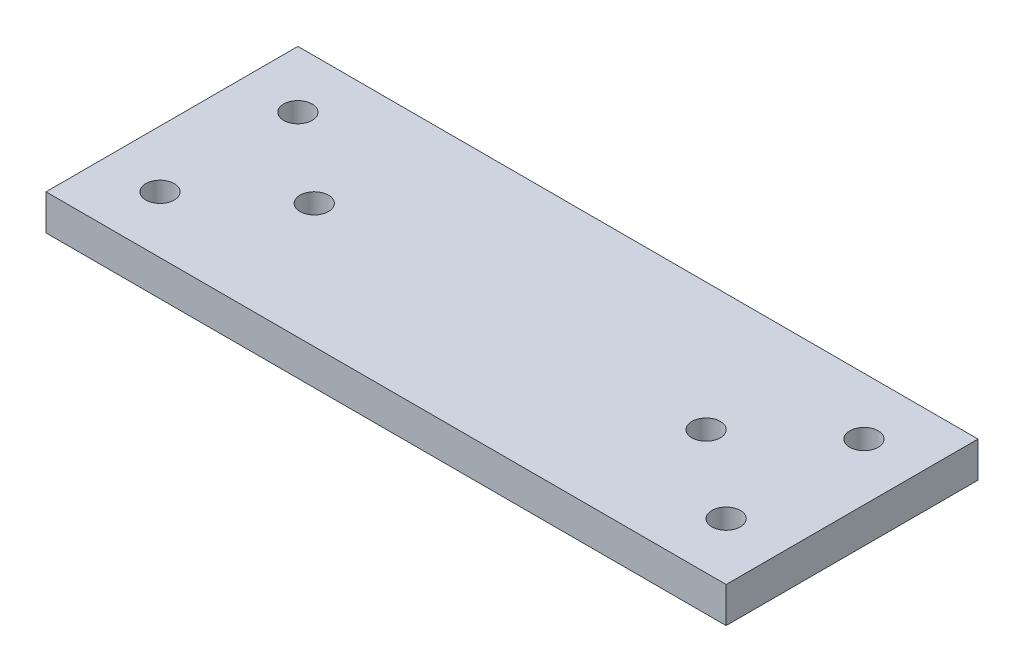
ISO-10303-21;
HEADER;
FILE_DESCRIPTION(('STEP AP214'),'2;1');
FILE_NAME('part.step','',(''),(''),'','','');
FILE_SCHEMA(('AUTOMOTIVE_DESIGN { 1 0 10303 214 1 1 1 1 }'));
ENDSEC;
DATA;
#1=APPLICATION_CONTEXT('core data for automotive mechanical design processes');
#2=APPLICATION_PROTOCOL_DEFINITION('international standard','automotive_design',2000,#1);
#3=PRODUCT_CONTEXT('',#1,'mechanical');
#4=PRODUCT('Part','Part','',(#3));
#5=PRODUCT_RELATED_PRODUCT_CATEGORY('part','',(#4));
#6=PRODUCT_DEFINITION_FORMATION('','',#4);
#7=PRODUCT_DEFINITION_CONTEXT('part definition',#1,'design');
#8=PRODUCT_DEFINITION('design','',#6,#7);
#9=PRODUCT_DEFINITION_SHAPE('','',#8);
#10=(LENGTH_UNIT() NAMED_UNIT(*) SI_UNIT(.MILLI.,.METRE.));
#11=(NAMED_UNIT(*) PLANE_ANGLE_UNIT() SI_UNIT($,.RADIAN.));
#12=(NAMED_UNIT(*) SI_UNIT($,.STERADIAN.) SOLID_ANGLE_UNIT());
#13=UNCERTAINTY_MEASURE_WITH_UNIT(LENGTH_MEASURE(1.E-05),#10,'distance_accuracy_value','');
#14=(GEOMETRIC_REPRESENTATION_CONTEXT(3) GLOBAL_UNCERTAINTY_ASSIGNED_CONTEXT((#13)) GLOBAL_UNIT_ASSIGNED_CONTEXT((#10,
#11,#12)) REPRESENTATION_CONTEXT('',''));
#15=CARTESIAN_POINT('',(0.,0.,0.));
#16=DIRECTION('',(0.,0.,1.));
#17=DIRECTION('',(1.,0.,0.));
#18=AXIS2_PLACEMENT_3D('',#15,#16,#17);
#19=CARTESIAN_POINT('',(0.,5.,0.));
#20=DIRECTION('',(0.,1.,0.));
#21=DIRECTION('',(0.,0.,1.));
#22=AXIS2_PLACEMENT_3D('',#19,#20,#21);
#23=PLANE('',#22);
#24=CARTESIAN_POINT('',(36.0289402173913,5.,2.73516549125994));
#25=DIRECTION('',(0.,1.,0.));
#26=DIRECTION('',(0.,0.,1.));
#27=AXIS2_PLACEMENT_3D('',#24,#25,#26);
#28=CIRCLE('',#27,2.);
#29=CARTESIAN_POINT('',(36.0289402173913,5.,4.73516549125994));
#30=VERTEX_POINT('',#29);
#31=EDGE_CURVE('E146',#30,#30,#28,.T.);
#32=ORIENTED_EDGE('',*,*,#31,.F.);
#33=EDGE_LOOP('',(#32));
#34=FACE_BOUND('',#33,.T.);
#35=CARTESIAN_POINT('',(-18.9710597826087,5.,2.73516549125994));
#36=DIRECTION('',(0.,1.,0.));
#37=DIRECTION('',(0.,0.,1.));
#38=AXIS2_PLACEMENT_3D('',#35,#36,#37);
#39=CIRCLE('',#38,2.);
#40=CARTESIAN_POINT('',(-18.9710597826087,5.,4.73516549125994));
#41=VERTEX_POINT('',#40);
#42=EDGE_CURVE('E140',#41,#41,#39,.T.);
#43=ORIENTED_EDGE('',*,*,#42,.F.);
#44=EDGE_LOOP('',(#43));
#45=FACE_BOUND('',#44,.T.);
#46=CARTESIAN_POINT('',(-31.1960597826087,5.,-7.19510869565213));
#47=DIRECTION('',(0.,1.,0.));
#48=DIRECTION('',(0.,0.,1.));
#49=AXIS2_PLACEMENT_3D('',#46,#47,#48);
#50=CIRCLE('',#49,2.);
#51=CARTESIAN_POINT('',(-31.1960597826087,5.,-5.19510869565212));
#52=VERTEX_POINT('',#51);
#53=EDGE_CURVE('E125',#52,#52,#50,.T.);
#54=ORIENTED_EDGE('',*,*,#53,.F.);
#55=EDGE_LOOP('',(#54));
#56=FACE_BOUND('',#55,.T.);
#57=CARTESIAN_POINT('',(48.2539402173913,5.,-7.19510869565213));
#58=DIRECTION('',(0.,1.,0.));
#59=DIRECTION('',(0.,0.,1.));
#60=AXIS2_PLACEMENT_3D('',#57,#58,#59);
#61=CIRCLE('',#60,2.);
#62=CARTESIAN_POINT('',(48.2539402173913,5.,-5.19510869565212));
#63=VERTEX_POINT('',#62);
#64=EDGE_CURVE('E104',#63,#63,#61,.T.);
#65=ORIENTED_EDGE('',*,*,#64,.F.);
#66=EDGE_LOOP('',(#65));
#67=FACE_BOUND('',#66,.T.);
#68=DIRECTION('',(0.,0.,1.));
#69=VECTOR('',#68,1.);
#70=CARTESIAN_POINT('',(-39.1960597826087,5.,-15.1951086956521));
#71=LINE('',#70,#69);
#72=CARTESIAN_POINT('',(-39.1960597826087,5.,-15.1951086956521));
#73=VERTEX_POINT('',#72);
#74=CARTESIAN_POINT('',(-39.1960597826087,5.,20.1548913043479));
#75=VERTEX_POINT('',#74);
#76=EDGE_CURVE('E89',#73,#75,#71,.T.);
#77=ORIENTED_EDGE('',*,*,#76,.T.);
#78=DIRECTION('',(1.,0.,0.));
#79=VECTOR('',#78,1.);
#80=CARTESIAN_POINT('',(-39.1960597826087,5.,20.1548913043479));
#81=LINE('',#80,#79);
#82=CARTESIAN_POINT('',(56.2539402173913,5.,20.1548913043479));
#83=VERTEX_POINT('',#82);
#84=EDGE_CURVE('E84',#75,#83,#81,.T.);
#85=ORIENTED_EDGE('',*,*,#84,.T.);
#86=DIRECTION('',(0.,0.,-1.));
#87=VECTOR('',#86,1.);
#88=CARTESIAN_POINT('',(56.2539402173913,5.,-15.1951086956521));
#89=LINE('',#88,#87);
#90=CARTESIAN_POINT('',(56.2539402173913,5.,-15.1951086956521));
#91=VERTEX_POINT('',#90);
#92=EDGE_CURVE('E87',#83,#91,#89,.T.);
#93=ORIENTED_EDGE('',*,*,#92,.T.);
#94=DIRECTION('',(-1.,0.,0.));
#95=VECTOR('',#94,1.);
#96=CARTESIAN_POINT('',(-39.1960597826087,5.,-15.1951086956521));
#97=LINE('',#96,#95);
#98=EDGE_CURVE('E54',#91,#73,#97,.T.);
#99=ORIENTED_EDGE('',*,*,#98,.T.);
#100=EDGE_LOOP('',(#77,#85,#93,#99));
#101=FACE_BOUND('',#100,.T.);
#102=CARTESIAN_POINT('',(-31.1960597826087,5.,12.1548913043479));
#103=DIRECTION('',(0.,1.,0.));
#104=DIRECTION('',(0.,0.,1.));
#105=AXIS2_PLACEMENT_3D('',#102,#103,#104);
#106=CIRCLE('',#105,2.);
#107=CARTESIAN_POINT('',(-31.1960597826087,5.,14.1548913043479));
#108=VERTEX_POINT('',#107);
#109=EDGE_CURVE('E119',#108,#108,#106,.T.);
#110=ORIENTED_EDGE('',*,*,#109,.F.);
#111=EDGE_LOOP('',(#110));
#112=FACE_BOUND('',#111,.T.);
#113=CARTESIAN_POINT('',(48.2539402173913,5.,12.1548913043479));
#114=DIRECTION('',(0.,1.,0.));
#115=DIRECTION('',(0.,0.,1.));
#116=AXIS2_PLACEMENT_3D('',#113,#114,#115);
#117=CIRCLE('',#116,2.);
#118=CARTESIAN_POINT('',(48.2539402173913,5.,14.1548913043479));
#119=VERTEX_POINT('',#118);
#120=EDGE_CURVE('E131',#119,#119,#117,.T.);
#121=ORIENTED_EDGE('',*,*,#120,.F.);
#122=EDGE_LOOP('',(#121));
#123=FACE_BOUND('',#122,.T.);
#124=ADVANCED_FACE('F37',(#34,#45,#56,#67,#101,#112,#123),#23,.T.);
#125=CARTESIAN_POINT('',(0.,0.,0.));
#126=DIRECTION('',(0.,1.,0.));
#127=DIRECTION('',(0.,0.,1.));
#128=AXIS2_PLACEMENT_3D('',#125,#126,#127);
#129=PLANE('',#128);
#130=CARTESIAN_POINT('',(36.0289402173913,0.,2.73516549125994));
#131=DIRECTION('',(0.,1.,0.));
#132=DIRECTION('',(0.,0.,1.));
#133=AXIS2_PLACEMENT_3D('',#130,#131,#132);
#134=CIRCLE('',#133,2.);
#135=CARTESIAN_POINT('',(36.0289402173913,0.,4.73516549125994));
#136=VERTEX_POINT('',#135);
#137=EDGE_CURVE('E137',#136,#136,#134,.T.);
#138=ORIENTED_EDGE('',*,*,#137,.T.);
#139=EDGE_LOOP('',(#138));
#140=FACE_BOUND('',#139,.T.);
#141=CARTESIAN_POINT('',(-18.9710597826087,0.,2.73516549125994));
#142=DIRECTION('',(0.,1.,0.));
#143=DIRECTION('',(0.,0.,1.));
#144=AXIS2_PLACEMENT_3D('',#141,#142,#143);
#145=CIRCLE('',#144,2.);
#146=CARTESIAN_POINT('',(-18.9710597826087,0.,4.73516549125994));
#147=VERTEX_POINT('',#146);
#148=EDGE_CURVE('E143',#147,#147,#145,.T.);
#149=ORIENTED_EDGE('',*,*,#148,.T.);
#150=EDGE_LOOP('',(#149));
#151=FACE_BOUND('',#150,.T.);
#152=DIRECTION('',(0.,0.,1.));
#153=VECTOR('',#152,1.);
#154=CARTESIAN_POINT('',(-39.1960597826087,0.,-15.1951086956521));
#155=LINE('',#154,#153);
#156=CARTESIAN_POINT('',(-39.1960597826087,0.,-15.1951086956521));
#157=VERTEX_POINT('',#156);
#158=CARTESIAN_POINT('',(-39.1960597826087,0.,20.1548913043479));
#159=VERTEX_POINT('',#158);
#160=EDGE_CURVE('E101',#157,#159,#155,.T.);
#161=ORIENTED_EDGE('',*,*,#160,.F.);
#162=DIRECTION('',(-1.,0.,0.));
#163=VECTOR('',#162,1.);
#164=CARTESIAN_POINT('',(-39.1960597826087,0.,-15.1951086956521));
#165=LINE('',#164,#163);
#166=CARTESIAN_POINT('',(56.2539402173913,0.,-15.1951086956521));
#167=VERTEX_POINT('',#166);
#168=EDGE_CURVE('E77',#167,#157,#165,.T.);
#169=ORIENTED_EDGE('',*,*,#168,.F.);
#170=DIRECTION('',(0.,0.,-1.));
#171=VECTOR('',#170,1.);
#172=CARTESIAN_POINT('',(56.2539402173913,0.,-15.1951086956521));
#173=LINE('',#172,#171);
#174=CARTESIAN_POINT('',(56.2539402173913,0.,20.1548913043479));
#175=VERTEX_POINT('',#174);
#176=EDGE_CURVE('E71',#175,#167,#173,.T.);
#177=ORIENTED_EDGE('',*,*,#176,.F.);
#178=DIRECTION('',(1.,0.,0.));
#179=VECTOR('',#178,1.);
#180=CARTESIAN_POINT('',(-39.1960597826087,0.,20.1548913043479));
#181=LINE('',#180,#179);
#182=EDGE_CURVE('E93',#159,#175,#181,.T.);
#183=ORIENTED_EDGE('',*,*,#182,.F.);
#184=EDGE_LOOP('',(#161,#169,#177,#183));
#185=FACE_BOUND('',#184,.T.);
#186=CARTESIAN_POINT('',(48.2539402173913,0.,-7.19510869565213));
#187=DIRECTION('',(0.,1.,0.));
#188=DIRECTION('',(0.,0.,1.));
#189=AXIS2_PLACEMENT_3D('',#186,#187,#188);
#190=CIRCLE('',#189,2.);
#191=CARTESIAN_POINT('',(48.2539402173913,0.,-5.19510869565212));
#192=VERTEX_POINT('',#191);
#193=EDGE_CURVE('E116',#192,#192,#190,.T.);
#194=ORIENTED_EDGE('',*,*,#193,.T.);
#195=EDGE_LOOP('',(#194));
#196=FACE_BOUND('',#195,.T.);
#197=CARTESIAN_POINT('',(-31.1960597826087,0.,12.1548913043479));
#198=DIRECTION('',(0.,1.,0.));
#199=DIRECTION('',(0.,0.,1.));
#200=AXIS2_PLACEMENT_3D('',#197,#198,#199);
#201=CIRCLE('',#200,2.);
#202=CARTESIAN_POINT('',(-31.1960597826087,0.,14.1548913043479));
#203=VERTEX_POINT('',#202);
#204=EDGE_CURVE('E122',#203,#203,#201,.T.);
#205=ORIENTED_EDGE('',*,*,#204,.T.);
#206=EDGE_LOOP('',(#205));
#207=FACE_BOUND('',#206,.T.);
#208=CARTESIAN_POINT('',(-31.1960597826087,0.,-7.19510869565213));
#209=DIRECTION('',(0.,1.,0.));
#210=DIRECTION('',(0.,0.,1.));
#211=AXIS2_PLACEMENT_3D('',#208,#209,#210);
#212=CIRCLE('',#211,2.);
#213=CARTESIAN_POINT('',(-31.1960597826087,0.,-5.19510869565212));
#214=VERTEX_POINT('',#213);
#215=EDGE_CURVE('E128',#214,#214,#212,.T.);
#216=ORIENTED_EDGE('',*,*,#215,.T.);
#217=EDGE_LOOP('',(#216));
#218=FACE_BOUND('',#217,.T.);
#219=CARTESIAN_POINT('',(48.2539402173913,0.,12.1548913043479));
#220=DIRECTION('',(0.,1.,0.));
#221=DIRECTION('',(0.,0.,1.));
#222=AXIS2_PLACEMENT_3D('',#219,#220,#221);
#223=CIRCLE('',#222,2.);
#224=CARTESIAN_POINT('',(48.2539402173913,0.,14.1548913043479));
#225=VERTEX_POINT('',#224);
#226=EDGE_CURVE('E134',#225,#225,#223,.T.);
#227=ORIENTED_EDGE('',*,*,#226,.T.);
#228=EDGE_LOOP('',(#227));
#229=FACE_BOUND('',#228,.T.);
#230=ADVANCED_FACE('F112',(#140,#151,#185,#196,#207,#218,#229),#129,.F.);
#231=CARTESIAN_POINT('',(-39.1960597826087,5.,-15.1951086956521));
#232=DIRECTION('',(1.,0.,0.));
#233=DIRECTION('',(0.,0.,-1.));
#234=AXIS2_PLACEMENT_3D('',#231,#232,#233);
#235=PLANE('',#234);
#236=ORIENTED_EDGE('',*,*,#160,.T.);
#237=DIRECTION('',(0.,-1.,0.));
#238=VECTOR('',#237,1.);
#239=CARTESIAN_POINT('',(-39.1960597826087,5.,20.1548913043479));
#240=LINE('',#239,#238);
#241=EDGE_CURVE('E11',#75,#159,#240,.T.);
#242=ORIENTED_EDGE('',*,*,#241,.F.);
#243=ORIENTED_EDGE('',*,*,#76,.F.);
#244=DIRECTION('',(0.,-1.,0.));
#245=VECTOR('',#244,1.);
#246=CARTESIAN_POINT('',(-39.1960597826087,5.,-15.1951086956521));
#247=LINE('',#246,#245);
#248=EDGE_CURVE('E97',#73,#157,#247,.T.);
#249=ORIENTED_EDGE('',*,*,#248,.T.);
#250=EDGE_LOOP('',(#236,#242,#243,#249));
#251=FACE_BOUND('',#250,.T.);
#252=ADVANCED_FACE('F39',(#251),#235,.F.);
#253=CARTESIAN_POINT('',(-39.1960597826087,5.,20.1548913043479));
#254=DIRECTION('',(0.,0.,-1.));
#255=DIRECTION('',(-1.,0.,0.));
#256=AXIS2_PLACEMENT_3D('',#253,#254,#255);
#257=PLANE('',#256);
#258=ORIENTED_EDGE('',*,*,#182,.T.);
#259=DIRECTION('',(0.,-1.,0.));
#260=VECTOR('',#259,1.);
#261=CARTESIAN_POINT('',(56.2539402173913,5.,20.1548913043479));
#262=LINE('',#261,#260);
#263=EDGE_CURVE('E46',#83,#175,#262,.T.);
#264=ORIENTED_EDGE('',*,*,#263,.F.);
#265=ORIENTED_EDGE('',*,*,#84,.F.);
#266=ORIENTED_EDGE('',*,*,#241,.T.);
#267=EDGE_LOOP('',(#258,#264,#265,#266));
#268=FACE_BOUND('',#267,.T.);
#269=ADVANCED_FACE('F92',(#268),#257,.F.);
#270=CARTESIAN_POINT('',(56.2539402173913,5.,-15.1951086956521));
#271=DIRECTION('',(-1.,0.,0.));
#272=DIRECTION('',(0.,0.,1.));
#273=AXIS2_PLACEMENT_3D('',#270,#271,#272);
#274=PLANE('',#273);
#275=ORIENTED_EDGE('',*,*,#176,.T.);
#276=DIRECTION('',(0.,-1.,0.));
#277=VECTOR('',#276,1.);
#278=CARTESIAN_POINT('',(56.2539402173913,5.,-15.1951086956521));
#279=LINE('',#278,#277);
#280=EDGE_CURVE('E94',#91,#167,#279,.T.);
#281=ORIENTED_EDGE('',*,*,#280,.F.);
#282=ORIENTED_EDGE('',*,*,#92,.F.);
#283=ORIENTED_EDGE('',*,*,#263,.T.);
#284=EDGE_LOOP('',(#275,#281,#282,#283));
#285=FACE_BOUND('',#284,.T.);
#286=ADVANCED_FACE('F95',(#285),#274,.F.);
#287=CARTESIAN_POINT('',(-39.1960597826087,5.,-15.1951086956521));
#288=DIRECTION('',(0.,0.,1.));
#289=DIRECTION('',(1.,0.,0.));
#290=AXIS2_PLACEMENT_3D('',#287,#288,#289);
#291=PLANE('',#290);
#292=ORIENTED_EDGE('',*,*,#168,.T.);
#293=ORIENTED_EDGE('',*,*,#248,.F.);
#294=ORIENTED_EDGE('',*,*,#98,.F.);
#295=ORIENTED_EDGE('',*,*,#280,.T.);
#296=EDGE_LOOP('',(#292,#293,#294,#295));
#297=FACE_BOUND('',#296,.T.);
#298=ADVANCED_FACE('F109',(#297),#291,.F.);
#299=CARTESIAN_POINT('',(48.2539402173913,5.,-7.19510869565213));
#300=DIRECTION('',(0.,-1.,0.));
#301=DIRECTION('',(0.,0.,-1.));
#302=AXIS2_PLACEMENT_3D('',#299,#300,#301);
#303=CYLINDRICAL_SURFACE('',#302,2.);
#304=ORIENTED_EDGE('',*,*,#64,.T.);
#305=EDGE_LOOP('',(#304));
#306=FACE_BOUND('',#305,.T.);
#307=ORIENTED_EDGE('',*,*,#193,.F.);
#308=EDGE_LOOP('',(#307));
#309=FACE_BOUND('',#308,.T.);
#310=ADVANCED_FACE('F170',(#306,#309),#303,.F.);
#311=CARTESIAN_POINT('',(-31.1960597826087,5.,12.1548913043479));
#312=DIRECTION('',(0.,-1.,0.));
#313=DIRECTION('',(0.,0.,-1.));
#314=AXIS2_PLACEMENT_3D('',#311,#312,#313);
#315=CYLINDRICAL_SURFACE('',#314,2.);
#316=ORIENTED_EDGE('',*,*,#109,.T.);
#317=EDGE_LOOP('',(#316));
#318=FACE_BOUND('',#317,.T.);
#319=ORIENTED_EDGE('',*,*,#204,.F.);
#320=EDGE_LOOP('',(#319));
#321=FACE_BOUND('',#320,.T.);
#322=ADVANCED_FACE('F173',(#318,#321),#315,.F.);
#323=CARTESIAN_POINT('',(-31.1960597826087,5.,-7.19510869565213));
#324=DIRECTION('',(0.,-1.,0.));
#325=DIRECTION('',(0.,0.,-1.));
#326=AXIS2_PLACEMENT_3D('',#323,#324,#325);
#327=CYLINDRICAL_SURFACE('',#326,2.);
#328=ORIENTED_EDGE('',*,*,#53,.T.);
#329=EDGE_LOOP('',(#328));
#330=FACE_BOUND('',#329,.T.);
#331=ORIENTED_EDGE('',*,*,#215,.F.);
#332=EDGE_LOOP('',(#331));
#333=FACE_BOUND('',#332,.T.);
#334=ADVANCED_FACE('F187',(#330,#333),#327,.F.);
#335=CARTESIAN_POINT('',(48.2539402173913,5.,12.1548913043479));
#336=DIRECTION('',(0.,-1.,0.));
#337=DIRECTION('',(0.,0.,-1.));
#338=AXIS2_PLACEMENT_3D('',#335,#336,#337);
#339=CYLINDRICAL_SURFACE('',#338,2.);
#340=ORIENTED_EDGE('',*,*,#120,.T.);
#341=EDGE_LOOP('',(#340));
#342=FACE_BOUND('',#341,.T.);
#343=ORIENTED_EDGE('',*,*,#226,.F.);
#344=EDGE_LOOP('',(#343));
#345=FACE_BOUND('',#344,.T.);
#346=ADVANCED_FACE('F185',(#342,#345),#339,.F.);
#347=CARTESIAN_POINT('',(-18.9710597826087,0.,2.73516549125994));
#348=DIRECTION('',(0.,1.,0.));
#349=DIRECTION('',(0.,0.,1.));
#350=AXIS2_PLACEMENT_3D('',#347,#348,#349);
#351=CYLINDRICAL_SURFACE('',#350,2.);
#352=ORIENTED_EDGE('',*,*,#148,.F.);
#353=EDGE_LOOP('',(#352));
#354=FACE_BOUND('',#353,.T.);
#355=ORIENTED_EDGE('',*,*,#42,.T.);
#356=EDGE_LOOP('',(#355));
#357=FACE_BOUND('',#356,.T.);
#358=ADVANCED_FACE('F157',(#354,#357),#351,.F.);
#359=CARTESIAN_POINT('',(36.0289402173913,0.,2.73516549125994));
#360=DIRECTION('',(0.,1.,0.));
#361=DIRECTION('',(0.,0.,1.));
#362=AXIS2_PLACEMENT_3D('',#359,#360,#361);
#363=CYLINDRICAL_SURFACE('',#362,2.);
#364=ORIENTED_EDGE('',*,*,#137,.F.);
#365=EDGE_LOOP('',(#364));
#366=FACE_BOUND('',#365,.T.);
#367=ORIENTED_EDGE('',*,*,#31,.T.);
#368=EDGE_LOOP('',(#367));
#369=FACE_BOUND('',#368,.T.);
#370=ADVANCED_FACE('F154',(#366,#369),#363,.F.);
#371=CLOSED_SHELL('',(#124,#230,#252,#269,#286,#298,#310,#322,#334,#346,#358,#370));
#372=MANIFOLD_SOLID_BREP('B2',#371);
#373=ADVANCED_BREP_SHAPE_REPRESENTATION('',(#18,#372),#14);
#374=SHAPE_DEFINITION_REPRESENTATION(#9,#373);
ENDSEC;
END-ISO-10303-21;
